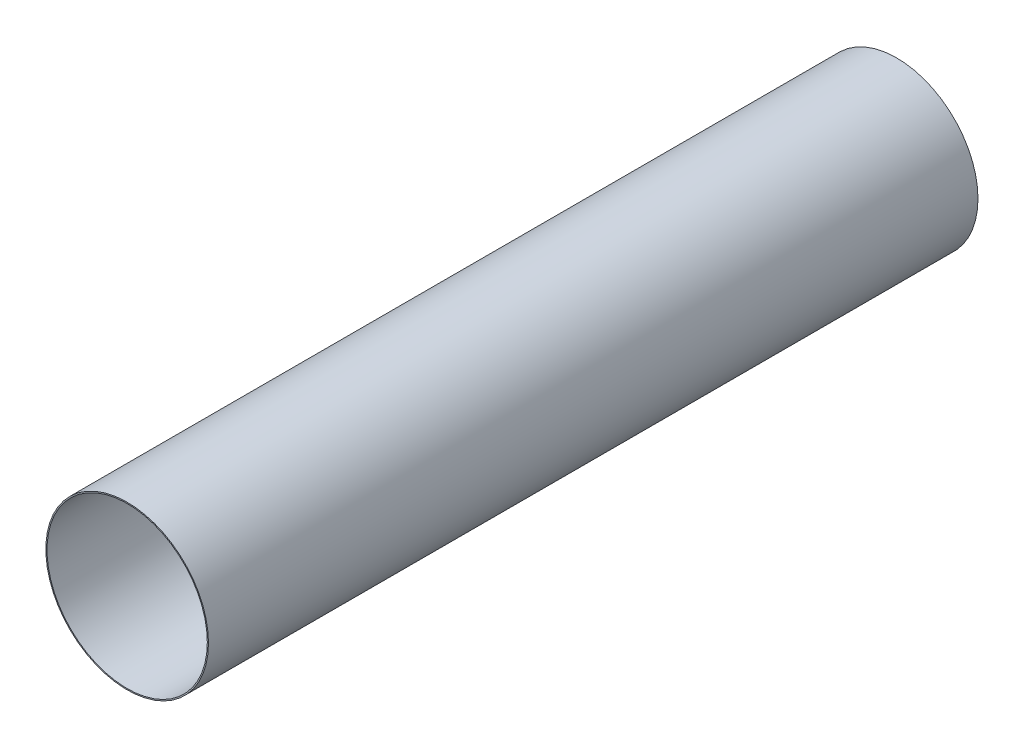
ISO-10303-21;
HEADER;
FILE_DESCRIPTION(('STEP AP214'),'2;1');
FILE_NAME('part.step','',(''),(''),'','','');
FILE_SCHEMA(('AUTOMOTIVE_DESIGN { 1 0 10303 214 1 1 1 1 }'));
ENDSEC;
DATA;
#1=APPLICATION_CONTEXT('core data for automotive mechanical design processes');
#2=APPLICATION_PROTOCOL_DEFINITION('international standard','automotive_design',2000,#1);
#3=PRODUCT_CONTEXT('',#1,'mechanical');
#4=PRODUCT('Part','Part','',(#3));
#5=PRODUCT_RELATED_PRODUCT_CATEGORY('part','',(#4));
#6=PRODUCT_DEFINITION_FORMATION('','',#4);
#7=PRODUCT_DEFINITION_CONTEXT('part definition',#1,'design');
#8=PRODUCT_DEFINITION('design','',#6,#7);
#9=PRODUCT_DEFINITION_SHAPE('','',#8);
#10=(LENGTH_UNIT() NAMED_UNIT(*) SI_UNIT(.MILLI.,.METRE.));
#11=(NAMED_UNIT(*) PLANE_ANGLE_UNIT() SI_UNIT($,.RADIAN.));
#12=(NAMED_UNIT(*) SI_UNIT($,.STERADIAN.) SOLID_ANGLE_UNIT());
#13=UNCERTAINTY_MEASURE_WITH_UNIT(LENGTH_MEASURE(1.E-05),#10,'distance_accuracy_value','');
#14=(GEOMETRIC_REPRESENTATION_CONTEXT(3) GLOBAL_UNCERTAINTY_ASSIGNED_CONTEXT((#13)) GLOBAL_UNIT_ASSIGNED_CONTEXT((#10,
#11,#12)) REPRESENTATION_CONTEXT('',''));
#15=CARTESIAN_POINT('',(0.,0.,0.));
#16=DIRECTION('',(0.,0.,1.));
#17=DIRECTION('',(1.,0.,0.));
#18=AXIS2_PLACEMENT_3D('',#15,#16,#17);
#19=CARTESIAN_POINT('',(0.,0.,762.));
#20=DIRECTION('',(0.,0.,1.));
#21=DIRECTION('',(1.,0.,0.));
#22=AXIS2_PLACEMENT_3D('',#19,#20,#21);
#23=PLANE('',#22);
#24=CARTESIAN_POINT('',(0.,0.,762.));
#25=DIRECTION('',(0.,0.,1.));
#26=DIRECTION('',(1.,0.,0.));
#27=AXIS2_PLACEMENT_3D('',#24,#25,#26);
#28=CIRCLE('',#27,80.518);
#29=CARTESIAN_POINT('',(80.518,0.,762.));
#30=VERTEX_POINT('',#29);
#31=EDGE_CURVE('E10',#30,#30,#28,.T.);
#32=ORIENTED_EDGE('',*,*,#31,.T.);
#33=EDGE_LOOP('',(#32));
#34=FACE_BOUND('',#33,.T.);
#35=CARTESIAN_POINT('',(0.,0.,762.));
#36=DIRECTION('',(0.,0.,1.));
#37=DIRECTION('',(1.,0.,0.));
#38=AXIS2_PLACEMENT_3D('',#35,#36,#37);
#39=CIRCLE('',#38,79.375);
#40=CARTESIAN_POINT('',(79.375,0.,762.));
#41=VERTEX_POINT('',#40);
#42=EDGE_CURVE('E46',#41,#41,#39,.T.);
#43=ORIENTED_EDGE('',*,*,#42,.F.);
#44=EDGE_LOOP('',(#43));
#45=FACE_BOUND('',#44,.T.);
#46=ADVANCED_FACE('F35',(#34,#45),#23,.T.);
#47=CARTESIAN_POINT('',(0.,0.,0.));
#48=DIRECTION('',(0.,0.,1.));
#49=DIRECTION('',(1.,0.,0.));
#50=AXIS2_PLACEMENT_3D('',#47,#48,#49);
#51=PLANE('',#50);
#52=CARTESIAN_POINT('',(0.,0.,0.));
#53=DIRECTION('',(0.,0.,1.));
#54=DIRECTION('',(1.,0.,0.));
#55=AXIS2_PLACEMENT_3D('',#52,#53,#54);
#56=CIRCLE('',#55,80.518);
#57=CARTESIAN_POINT('',(80.518,0.,0.));
#58=VERTEX_POINT('',#57);
#59=EDGE_CURVE('E39',#58,#58,#56,.T.);
#60=ORIENTED_EDGE('',*,*,#59,.F.);
#61=EDGE_LOOP('',(#60));
#62=FACE_BOUND('',#61,.T.);
#63=CARTESIAN_POINT('',(0.,0.,0.));
#64=DIRECTION('',(0.,0.,1.));
#65=DIRECTION('',(1.,0.,0.));
#66=AXIS2_PLACEMENT_3D('',#63,#64,#65);
#67=CIRCLE('',#66,79.375);
#68=CARTESIAN_POINT('',(79.375,0.,0.));
#69=VERTEX_POINT('',#68);
#70=EDGE_CURVE('E48',#69,#69,#67,.T.);
#71=ORIENTED_EDGE('',*,*,#70,.T.);
#72=EDGE_LOOP('',(#71));
#73=FACE_BOUND('',#72,.T.);
#74=ADVANCED_FACE('F58',(#62,#73),#51,.F.);
#75=CARTESIAN_POINT('',(0.,0.,762.));
#76=DIRECTION('',(0.,0.,-1.));
#77=DIRECTION('',(-1.,0.,0.));
#78=AXIS2_PLACEMENT_3D('',#75,#76,#77);
#79=CYLINDRICAL_SURFACE('',#78,80.518);
#80=ORIENTED_EDGE('',*,*,#31,.F.);
#81=EDGE_LOOP('',(#80));
#82=FACE_BOUND('',#81,.T.);
#83=ORIENTED_EDGE('',*,*,#59,.T.);
#84=EDGE_LOOP('',(#83));
#85=FACE_BOUND('',#84,.T.);
#86=ADVANCED_FACE('F37',(#82,#85),#79,.T.);
#87=CARTESIAN_POINT('',(0.,0.,762.));
#88=DIRECTION('',(0.,0.,-1.));
#89=DIRECTION('',(-1.,0.,0.));
#90=AXIS2_PLACEMENT_3D('',#87,#88,#89);
#91=CYLINDRICAL_SURFACE('',#90,79.375);
#92=ORIENTED_EDGE('',*,*,#42,.T.);
#93=EDGE_LOOP('',(#92));
#94=FACE_BOUND('',#93,.T.);
#95=ORIENTED_EDGE('',*,*,#70,.F.);
#96=EDGE_LOOP('',(#95));
#97=FACE_BOUND('',#96,.T.);
#98=ADVANCED_FACE('F54',(#94,#97),#91,.F.);
#99=CLOSED_SHELL('',(#46,#74,#86,#98));
#100=MANIFOLD_SOLID_BREP('B2',#99);
#101=ADVANCED_BREP_SHAPE_REPRESENTATION('',(#18,#100),#14);
#102=SHAPE_DEFINITION_REPRESENTATION(#9,#101);
ENDSEC;
END-ISO-10303-21;
